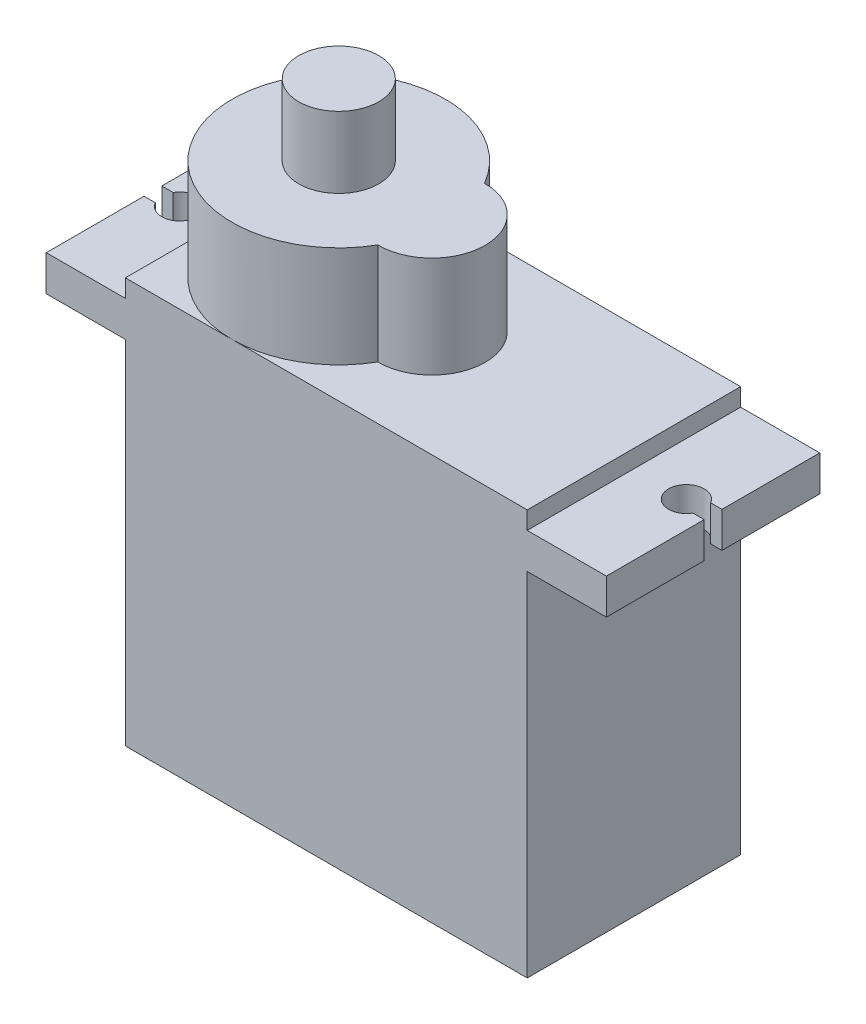
ISO-10303-21;
HEADER;
FILE_DESCRIPTION(('STEP AP214'),'2;1');
FILE_NAME('part.step','',(''),(''),'','','');
FILE_SCHEMA(('AUTOMOTIVE_DESIGN { 1 0 10303 214 1 1 1 1 }'));
ENDSEC;
DATA;
#1=APPLICATION_CONTEXT('core data for automotive mechanical design processes');
#2=APPLICATION_PROTOCOL_DEFINITION('international standard','automotive_design',2000,#1);
#3=PRODUCT_CONTEXT('',#1,'mechanical');
#4=PRODUCT('Part','Part','',(#3));
#5=PRODUCT_RELATED_PRODUCT_CATEGORY('part','',(#4));
#6=PRODUCT_DEFINITION_FORMATION('','',#4);
#7=PRODUCT_DEFINITION_CONTEXT('part definition',#1,'design');
#8=PRODUCT_DEFINITION('design','',#6,#7);
#9=PRODUCT_DEFINITION_SHAPE('','',#8);
#10=(LENGTH_UNIT() NAMED_UNIT(*) SI_UNIT(.MILLI.,.METRE.));
#11=(NAMED_UNIT(*) PLANE_ANGLE_UNIT() SI_UNIT($,.RADIAN.));
#12=(NAMED_UNIT(*) SI_UNIT($,.STERADIAN.) SOLID_ANGLE_UNIT());
#13=UNCERTAINTY_MEASURE_WITH_UNIT(LENGTH_MEASURE(1.E-05),#10,'distance_accuracy_value','');
#14=(GEOMETRIC_REPRESENTATION_CONTEXT(3) GLOBAL_UNCERTAINTY_ASSIGNED_CONTEXT((#13)) GLOBAL_UNIT_ASSIGNED_CONTEXT((#10,
#11,#12)) REPRESENTATION_CONTEXT('',''));
#15=CARTESIAN_POINT('',(0.,0.,0.));
#16=DIRECTION('',(0.,0.,1.));
#17=DIRECTION('',(1.,0.,0.));
#18=AXIS2_PLACEMENT_3D('',#15,#16,#17);
#19=CARTESIAN_POINT('',(0.,21.8,0.));
#20=DIRECTION('',(0.,1.,0.));
#21=DIRECTION('',(0.,0.,1.));
#22=AXIS2_PLACEMENT_3D('',#19,#20,#21);
#23=PLANE('',#22);
#24=CARTESIAN_POINT('',(-2.95,21.8,-6.));
#25=DIRECTION('',(0.,1.,0.));
#26=DIRECTION('',(0.,0.,1.));
#27=AXIS2_PLACEMENT_3D('',#24,#25,#26);
#28=CIRCLE('',#27,1.);
#29=CARTESIAN_POINT('',(-3.81602540378444,21.8,-5.5));
#30=VERTEX_POINT('',#29);
#31=CARTESIAN_POINT('',(-3.81602540378444,21.8,-6.5));
#32=VERTEX_POINT('',#31);
#33=EDGE_CURVE('E225',#30,#32,#28,.T.);
#34=ORIENTED_EDGE('',*,*,#33,.F.);
#35=DIRECTION('',(-1.,0.,0.));
#36=VECTOR('',#35,1.);
#37=CARTESIAN_POINT('',(0.,21.8,-5.5));
#38=LINE('',#37,#36);
#39=CARTESIAN_POINT('',(-4.45,21.8,-5.5));
#40=VERTEX_POINT('',#39);
#41=EDGE_CURVE('E204',#30,#40,#38,.T.);
#42=ORIENTED_EDGE('',*,*,#41,.T.);
#43=DIRECTION('',(0.,0.,1.));
#44=VECTOR('',#43,1.);
#45=CARTESIAN_POINT('',(-4.45,21.8,-12.));
#46=LINE('',#45,#44);
#47=CARTESIAN_POINT('',(-4.45,21.8,0.));
#48=VERTEX_POINT('',#47);
#49=EDGE_CURVE('E313',#40,#48,#46,.T.);
#50=ORIENTED_EDGE('',*,*,#49,.T.);
#51=DIRECTION('',(1.,0.,0.));
#52=VECTOR('',#51,1.);
#53=CARTESIAN_POINT('',(-4.45,21.8,0.));
#54=LINE('',#53,#52);
#55=CARTESIAN_POINT('',(0.,21.8,0.));
#56=VERTEX_POINT('',#55);
#57=EDGE_CURVE('E319',#48,#56,#54,.T.);
#58=ORIENTED_EDGE('',*,*,#57,.T.);
#59=DIRECTION('',(0.,0.,1.));
#60=VECTOR('',#59,1.);
#61=CARTESIAN_POINT('',(0.,21.8,0.));
#62=LINE('',#61,#60);
#63=CARTESIAN_POINT('',(0.,21.8,-12.));
#64=VERTEX_POINT('',#63);
#65=EDGE_CURVE('E278',#64,#56,#62,.T.);
#66=ORIENTED_EDGE('',*,*,#65,.F.);
#67=DIRECTION('',(-1.,0.,0.));
#68=VECTOR('',#67,1.);
#69=CARTESIAN_POINT('',(27.05,21.8,-12.));
#70=LINE('',#69,#68);
#71=CARTESIAN_POINT('',(-4.45,21.8,-12.));
#72=VERTEX_POINT('',#71);
#73=EDGE_CURVE('E314',#64,#72,#70,.T.);
#74=ORIENTED_EDGE('',*,*,#73,.T.);
#75=CARTESIAN_POINT('',(-4.45,21.8,-6.5));
#76=VERTEX_POINT('',#75);
#77=EDGE_CURVE('E315',#72,#76,#46,.T.);
#78=ORIENTED_EDGE('',*,*,#77,.T.);
#79=DIRECTION('',(1.,0.,0.));
#80=VECTOR('',#79,1.);
#81=CARTESIAN_POINT('',(0.,21.8,-6.5));
#82=LINE('',#81,#80);
#83=EDGE_CURVE('E55',#76,#32,#82,.T.);
#84=ORIENTED_EDGE('',*,*,#83,.T.);
#85=EDGE_LOOP('',(#34,#42,#50,#58,#66,#74,#78,#84));
#86=FACE_BOUND('',#85,.T.);
#87=ADVANCED_FACE('F38',(#86),#23,.T.);
#88=CARTESIAN_POINT('',(0.,19.8,0.));
#89=DIRECTION('',(0.,1.,0.));
#90=DIRECTION('',(0.,0.,1.));
#91=AXIS2_PLACEMENT_3D('',#88,#89,#90);
#92=PLANE('',#91);
#93=DIRECTION('',(1.,0.,0.));
#94=VECTOR('',#93,1.);
#95=CARTESIAN_POINT('',(0.,19.8,-5.5));
#96=LINE('',#95,#94);
#97=CARTESIAN_POINT('',(-4.45,19.8,-5.5));
#98=VERTEX_POINT('',#97);
#99=CARTESIAN_POINT('',(-3.81602540378444,19.8,-5.5));
#100=VERTEX_POINT('',#99);
#101=EDGE_CURVE('E201',#98,#100,#96,.T.);
#102=ORIENTED_EDGE('',*,*,#101,.T.);
#103=CARTESIAN_POINT('',(-2.95,19.8,-6.));
#104=DIRECTION('',(0.,1.,0.));
#105=DIRECTION('',(0.,0.,1.));
#106=AXIS2_PLACEMENT_3D('',#103,#104,#105);
#107=CIRCLE('',#106,1.);
#108=CARTESIAN_POINT('',(-3.81602540378444,19.8,-6.5));
#109=VERTEX_POINT('',#108);
#110=EDGE_CURVE('E211',#109,#100,#107,.F.);
#111=ORIENTED_EDGE('',*,*,#110,.F.);
#112=DIRECTION('',(-1.,0.,0.));
#113=VECTOR('',#112,1.);
#114=CARTESIAN_POINT('',(0.,19.8,-6.5));
#115=LINE('',#114,#113);
#116=CARTESIAN_POINT('',(-4.45,19.8,-6.5));
#117=VERTEX_POINT('',#116);
#118=EDGE_CURVE('E223',#109,#117,#115,.T.);
#119=ORIENTED_EDGE('',*,*,#118,.T.);
#120=DIRECTION('',(0.,0.,1.));
#121=VECTOR('',#120,1.);
#122=CARTESIAN_POINT('',(-4.45,19.8,-12.));
#123=LINE('',#122,#121);
#124=CARTESIAN_POINT('',(-4.45,19.8,-12.));
#125=VERTEX_POINT('',#124);
#126=EDGE_CURVE('E329',#125,#117,#123,.T.);
#127=ORIENTED_EDGE('',*,*,#126,.F.);
#128=DIRECTION('',(-1.,0.,0.));
#129=VECTOR('',#128,1.);
#130=CARTESIAN_POINT('',(27.05,19.8,-12.));
#131=LINE('',#130,#129);
#132=CARTESIAN_POINT('',(0.,19.8,-12.));
#133=VERTEX_POINT('',#132);
#134=EDGE_CURVE('E310',#133,#125,#131,.T.);
#135=ORIENTED_EDGE('',*,*,#134,.F.);
#136=DIRECTION('',(0.,0.,1.));
#137=VECTOR('',#136,1.);
#138=CARTESIAN_POINT('',(0.,19.8,0.));
#139=LINE('',#138,#137);
#140=CARTESIAN_POINT('',(0.,19.8,0.));
#141=VERTEX_POINT('',#140);
#142=EDGE_CURVE('E352',#133,#141,#139,.T.);
#143=ORIENTED_EDGE('',*,*,#142,.T.);
#144=DIRECTION('',(1.,0.,0.));
#145=VECTOR('',#144,1.);
#146=CARTESIAN_POINT('',(-4.45,19.8,0.));
#147=LINE('',#146,#145);
#148=CARTESIAN_POINT('',(-4.45,19.8,0.));
#149=VERTEX_POINT('',#148);
#150=EDGE_CURVE('E333',#149,#141,#147,.T.);
#151=ORIENTED_EDGE('',*,*,#150,.F.);
#152=EDGE_CURVE('E222',#98,#149,#123,.T.);
#153=ORIENTED_EDGE('',*,*,#152,.F.);
#154=EDGE_LOOP('',(#102,#111,#119,#127,#135,#143,#151,#153));
#155=FACE_BOUND('',#154,.T.);
#156=ADVANCED_FACE('F220',(#155),#92,.F.);
#157=CARTESIAN_POINT('',(-4.45,21.8,-12.));
#158=DIRECTION('',(1.,0.,0.));
#159=DIRECTION('',(0.,0.,-1.));
#160=AXIS2_PLACEMENT_3D('',#157,#158,#159);
#161=PLANE('',#160);
#162=DIRECTION('',(0.,1.,0.));
#163=VECTOR('',#162,1.);
#164=CARTESIAN_POINT('',(-4.45,-0.001000000000001,-5.5));
#165=LINE('',#164,#163);
#166=EDGE_CURVE('E217',#98,#40,#165,.T.);
#167=ORIENTED_EDGE('',*,*,#166,.F.);
#168=ORIENTED_EDGE('',*,*,#152,.T.);
#169=DIRECTION('',(0.,-1.,0.));
#170=VECTOR('',#169,1.);
#171=CARTESIAN_POINT('',(-4.45,21.8,0.));
#172=LINE('',#171,#170);
#173=EDGE_CURVE('E345',#48,#149,#172,.T.);
#174=ORIENTED_EDGE('',*,*,#173,.F.);
#175=ORIENTED_EDGE('',*,*,#49,.F.);
#176=EDGE_LOOP('',(#167,#168,#174,#175));
#177=FACE_BOUND('',#176,.T.);
#178=ADVANCED_FACE('F468',(#177),#161,.F.);
#179=DIRECTION('',(0.,1.,0.));
#180=VECTOR('',#179,1.);
#181=CARTESIAN_POINT('',(-4.45,-0.001000000000001,-6.5));
#182=LINE('',#181,#180);
#183=EDGE_CURVE('E233',#117,#76,#182,.T.);
#184=ORIENTED_EDGE('',*,*,#183,.T.);
#185=ORIENTED_EDGE('',*,*,#77,.F.);
#186=DIRECTION('',(0.,-1.,0.));
#187=VECTOR('',#186,1.);
#188=CARTESIAN_POINT('',(-4.45,21.8,-12.));
#189=LINE('',#188,#187);
#190=EDGE_CURVE('E348',#72,#125,#189,.T.);
#191=ORIENTED_EDGE('',*,*,#190,.T.);
#192=ORIENTED_EDGE('',*,*,#126,.T.);
#193=EDGE_LOOP('',(#184,#185,#191,#192));
#194=FACE_BOUND('',#193,.T.);
#195=ADVANCED_FACE('F430',(#194),#161,.F.);
#196=CARTESIAN_POINT('',(27.05,21.8,0.));
#197=DIRECTION('',(-1.,0.,0.));
#198=DIRECTION('',(0.,0.,1.));
#199=AXIS2_PLACEMENT_3D('',#196,#197,#198);
#200=PLANE('',#199);
#201=DIRECTION('',(0.,0.,-1.));
#202=VECTOR('',#201,1.);
#203=CARTESIAN_POINT('',(27.05,21.8,0.));
#204=LINE('',#203,#202);
#205=CARTESIAN_POINT('',(27.05,21.8,-6.5));
#206=VERTEX_POINT('',#205);
#207=CARTESIAN_POINT('',(27.05,21.8,-12.));
#208=VERTEX_POINT('',#207);
#209=EDGE_CURVE('E321',#206,#208,#204,.T.);
#210=ORIENTED_EDGE('',*,*,#209,.F.);
#211=DIRECTION('',(0.,1.,0.));
#212=VECTOR('',#211,1.);
#213=CARTESIAN_POINT('',(27.05,-0.001000000000001,-6.5));
#214=LINE('',#213,#212);
#215=CARTESIAN_POINT('',(27.05,19.8,-6.5));
#216=VERTEX_POINT('',#215);
#217=EDGE_CURVE('E250',#216,#206,#214,.T.);
#218=ORIENTED_EDGE('',*,*,#217,.F.);
#219=DIRECTION('',(0.,0.,-1.));
#220=VECTOR('',#219,1.);
#221=CARTESIAN_POINT('',(27.05,19.8,0.));
#222=LINE('',#221,#220);
#223=CARTESIAN_POINT('',(27.05,19.8,-12.));
#224=VERTEX_POINT('',#223);
#225=EDGE_CURVE('E336',#216,#224,#222,.T.);
#226=ORIENTED_EDGE('',*,*,#225,.T.);
#227=DIRECTION('',(0.,-1.,0.));
#228=VECTOR('',#227,1.);
#229=CARTESIAN_POINT('',(27.05,21.8,-12.));
#230=LINE('',#229,#228);
#231=EDGE_CURVE('E325',#208,#224,#230,.T.);
#232=ORIENTED_EDGE('',*,*,#231,.F.);
#233=EDGE_LOOP('',(#210,#218,#226,#232));
#234=FACE_BOUND('',#233,.T.);
#235=ADVANCED_FACE('F412',(#234),#200,.F.);
#236=CARTESIAN_POINT('',(0.,22.8,0.));
#237=DIRECTION('',(0.,-1.,0.));
#238=DIRECTION('',(0.,0.,-1.));
#239=AXIS2_PLACEMENT_3D('',#236,#237,#238);
#240=PLANE('',#239);
#241=CARTESIAN_POINT('',(6.,22.8,-6.));
#242=DIRECTION('',(0.,1.,0.));
#243=DIRECTION('',(0.,0.,1.));
#244=AXIS2_PLACEMENT_3D('',#241,#242,#243);
#245=CIRCLE('',#244,6.);
#246=CARTESIAN_POINT('',(11.1963070609208,22.8,-8.99973214281289));
#247=VERTEX_POINT('',#246);
#248=CARTESIAN_POINT('',(6.,22.8,-12.));
#249=VERTEX_POINT('',#248);
#250=EDGE_CURVE('E259',#247,#249,#245,.T.);
#251=ORIENTED_EDGE('',*,*,#250,.F.);
#252=CARTESIAN_POINT('',(11.236395355661,22.8,-6.));
#253=DIRECTION('',(0.,1.,0.));
#254=DIRECTION('',(0.,0.,1.));
#255=AXIS2_PLACEMENT_3D('',#252,#253,#254);
#256=CIRCLE('',#255,3.);
#257=CARTESIAN_POINT('',(11.1963070609208,22.8,-3.00026785718711));
#258=VERTEX_POINT('',#257);
#259=EDGE_CURVE('E265',#258,#247,#256,.T.);
#260=ORIENTED_EDGE('',*,*,#259,.F.);
#261=CARTESIAN_POINT('',(6.,22.8,0.));
#262=VERTEX_POINT('',#261);
#263=EDGE_CURVE('E270',#262,#258,#245,.T.);
#264=ORIENTED_EDGE('',*,*,#263,.F.);
#265=DIRECTION('',(1.,0.,0.));
#266=VECTOR('',#265,1.);
#267=CARTESIAN_POINT('',(0.,22.8,0.));
#268=LINE('',#267,#266);
#269=CARTESIAN_POINT('',(22.6,22.8,0.));
#270=VERTEX_POINT('',#269);
#271=EDGE_CURVE('E282',#262,#270,#268,.T.);
#272=ORIENTED_EDGE('',*,*,#271,.T.);
#273=DIRECTION('',(0.,0.,-1.));
#274=VECTOR('',#273,1.);
#275=CARTESIAN_POINT('',(22.6,22.8,0.));
#276=LINE('',#275,#274);
#277=CARTESIAN_POINT('',(22.6,22.8,-12.));
#278=VERTEX_POINT('',#277);
#279=EDGE_CURVE('E287',#270,#278,#276,.T.);
#280=ORIENTED_EDGE('',*,*,#279,.T.);
#281=DIRECTION('',(-1.,0.,0.));
#282=VECTOR('',#281,1.);
#283=CARTESIAN_POINT('',(0.,22.8,-12.));
#284=LINE('',#283,#282);
#285=EDGE_CURVE('E290',#278,#249,#284,.T.);
#286=ORIENTED_EDGE('',*,*,#285,.T.);
#287=EDGE_LOOP('',(#251,#260,#264,#272,#280,#286));
#288=FACE_BOUND('',#287,.T.);
#289=ADVANCED_FACE('F395',(#288),#240,.F.);
#290=CARTESIAN_POINT('',(0.,22.8,-6.));
#291=VERTEX_POINT('',#290);
#292=EDGE_CURVE('E47',#249,#291,#245,.T.);
#293=ORIENTED_EDGE('',*,*,#292,.F.);
#294=CARTESIAN_POINT('',(0.,22.8,-12.));
#295=VERTEX_POINT('',#294);
#296=EDGE_CURVE('E289',#249,#295,#284,.T.);
#297=ORIENTED_EDGE('',*,*,#296,.T.);
#298=DIRECTION('',(0.,0.,1.));
#299=VECTOR('',#298,1.);
#300=CARTESIAN_POINT('',(0.,22.8,0.));
#301=LINE('',#300,#299);
#302=EDGE_CURVE('E279',#295,#291,#301,.T.);
#303=ORIENTED_EDGE('',*,*,#302,.T.);
#304=EDGE_LOOP('',(#293,#297,#303));
#305=FACE_BOUND('',#304,.T.);
#306=ADVANCED_FACE('F387',(#305),#240,.F.);
#307=CARTESIAN_POINT('',(0.,19.8,0.));
#308=DIRECTION('',(1.,0.,0.));
#309=DIRECTION('',(0.,0.,-1.));
#310=AXIS2_PLACEMENT_3D('',#307,#308,#309);
#311=PLANE('',#310);
#312=DIRECTION('',(0.,0.,1.));
#313=VECTOR('',#312,1.);
#314=CARTESIAN_POINT('',(0.,0.,0.));
#315=LINE('',#314,#313);
#316=CARTESIAN_POINT('',(0.,0.,-12.));
#317=VERTEX_POINT('',#316);
#318=CARTESIAN_POINT('',(0.,0.,0.));
#319=VERTEX_POINT('',#318);
#320=EDGE_CURVE('E351',#317,#319,#315,.T.);
#321=ORIENTED_EDGE('',*,*,#320,.T.);
#322=DIRECTION('',(0.,-1.,0.));
#323=VECTOR('',#322,1.);
#324=CARTESIAN_POINT('',(0.,19.8,0.));
#325=LINE('',#324,#323);
#326=EDGE_CURVE('E42',#141,#319,#325,.T.);
#327=ORIENTED_EDGE('',*,*,#326,.F.);
#328=ORIENTED_EDGE('',*,*,#142,.F.);
#329=DIRECTION('',(0.,-1.,0.));
#330=VECTOR('',#329,1.);
#331=CARTESIAN_POINT('',(0.,19.8,-12.));
#332=LINE('',#331,#330);
#333=EDGE_CURVE('E359',#133,#317,#332,.T.);
#334=ORIENTED_EDGE('',*,*,#333,.T.);
#335=EDGE_LOOP('',(#321,#327,#328,#334));
#336=FACE_BOUND('',#335,.T.);
#337=ADVANCED_FACE('F40',(#336),#311,.F.);
#338=CARTESIAN_POINT('',(0.,19.8,0.));
#339=DIRECTION('',(0.,0.,-1.));
#340=DIRECTION('',(-1.,0.,0.));
#341=AXIS2_PLACEMENT_3D('',#338,#339,#340);
#342=PLANE('',#341);
#343=DIRECTION('',(1.,0.,0.));
#344=VECTOR('',#343,1.);
#345=CARTESIAN_POINT('',(0.,0.,0.));
#346=LINE('',#345,#344);
#347=CARTESIAN_POINT('',(22.6,0.,0.));
#348=VERTEX_POINT('',#347);
#349=EDGE_CURVE('E362',#319,#348,#346,.T.);
#350=ORIENTED_EDGE('',*,*,#349,.T.);
#351=DIRECTION('',(0.,-1.,0.));
#352=VECTOR('',#351,1.);
#353=CARTESIAN_POINT('',(22.6,19.8,0.));
#354=LINE('',#353,#352);
#355=CARTESIAN_POINT('',(22.6,19.8,0.));
#356=VERTEX_POINT('',#355);
#357=EDGE_CURVE('E371',#356,#348,#354,.T.);
#358=ORIENTED_EDGE('',*,*,#357,.F.);
#359=CARTESIAN_POINT('',(27.05,19.8,0.));
#360=VERTEX_POINT('',#359);
#361=EDGE_CURVE('E332',#356,#360,#147,.T.);
#362=ORIENTED_EDGE('',*,*,#361,.T.);
#363=DIRECTION('',(0.,-1.,0.));
#364=VECTOR('',#363,1.);
#365=CARTESIAN_POINT('',(27.05,21.8,0.));
#366=LINE('',#365,#364);
#367=CARTESIAN_POINT('',(27.05,21.8,0.));
#368=VERTEX_POINT('',#367);
#369=EDGE_CURVE('E342',#368,#360,#366,.T.);
#370=ORIENTED_EDGE('',*,*,#369,.F.);
#371=CARTESIAN_POINT('',(22.6,21.8,0.));
#372=VERTEX_POINT('',#371);
#373=EDGE_CURVE('E318',#372,#368,#54,.T.);
#374=ORIENTED_EDGE('',*,*,#373,.F.);
#375=DIRECTION('',(0.,-1.,0.));
#376=VECTOR('',#375,1.);
#377=CARTESIAN_POINT('',(22.6,22.8,0.));
#378=LINE('',#377,#376);
#379=EDGE_CURVE('E304',#270,#372,#378,.T.);
#380=ORIENTED_EDGE('',*,*,#379,.F.);
#381=ORIENTED_EDGE('',*,*,#271,.F.);
#382=CARTESIAN_POINT('',(0.,22.8,0.));
#383=VERTEX_POINT('',#382);
#384=EDGE_CURVE('E284',#383,#262,#268,.T.);
#385=ORIENTED_EDGE('',*,*,#384,.F.);
#386=DIRECTION('',(0.,-1.,0.));
#387=VECTOR('',#386,1.);
#388=CARTESIAN_POINT('',(0.,22.8,0.));
#389=LINE('',#388,#387);
#390=EDGE_CURVE('E307',#383,#56,#389,.T.);
#391=ORIENTED_EDGE('',*,*,#390,.T.);
#392=ORIENTED_EDGE('',*,*,#57,.F.);
#393=ORIENTED_EDGE('',*,*,#173,.T.);
#394=ORIENTED_EDGE('',*,*,#150,.T.);
#395=ORIENTED_EDGE('',*,*,#326,.T.);
#396=EDGE_LOOP('',(#350,#358,#362,#370,#374,#380,#381,#385,#391,#392,#393,#394,#395));
#397=FACE_BOUND('',#396,.T.);
#398=ADVANCED_FACE('F439',(#397),#342,.F.);
#399=CARTESIAN_POINT('',(22.6,19.8,0.));
#400=DIRECTION('',(-1.,0.,0.));
#401=DIRECTION('',(0.,0.,1.));
#402=AXIS2_PLACEMENT_3D('',#399,#400,#401);
#403=PLANE('',#402);
#404=DIRECTION('',(0.,0.,-1.));
#405=VECTOR('',#404,1.);
#406=CARTESIAN_POINT('',(22.6,0.,0.));
#407=LINE('',#406,#405);
#408=CARTESIAN_POINT('',(22.6,0.,-12.));
#409=VERTEX_POINT('',#408);
#410=EDGE_CURVE('E364',#348,#409,#407,.T.);
#411=ORIENTED_EDGE('',*,*,#410,.T.);
#412=DIRECTION('',(0.,-1.,0.));
#413=VECTOR('',#412,1.);
#414=CARTESIAN_POINT('',(22.6,19.8,-12.));
#415=LINE('',#414,#413);
#416=CARTESIAN_POINT('',(22.6,19.8,-12.));
#417=VERTEX_POINT('',#416);
#418=EDGE_CURVE('E369',#417,#409,#415,.T.);
#419=ORIENTED_EDGE('',*,*,#418,.F.);
#420=DIRECTION('',(0.,0.,-1.));
#421=VECTOR('',#420,1.);
#422=CARTESIAN_POINT('',(22.6,19.8,0.));
#423=LINE('',#422,#421);
#424=EDGE_CURVE('E355',#356,#417,#423,.T.);
#425=ORIENTED_EDGE('',*,*,#424,.F.);
#426=ORIENTED_EDGE('',*,*,#357,.T.);
#427=EDGE_LOOP('',(#411,#419,#425,#426));
#428=FACE_BOUND('',#427,.T.);
#429=ADVANCED_FACE('F496',(#428),#403,.F.);
#430=CARTESIAN_POINT('',(0.,19.8,-12.));
#431=DIRECTION('',(0.,0.,1.));
#432=DIRECTION('',(1.,0.,0.));
#433=AXIS2_PLACEMENT_3D('',#430,#431,#432);
#434=PLANE('',#433);
#435=DIRECTION('',(-1.,0.,0.));
#436=VECTOR('',#435,1.);
#437=CARTESIAN_POINT('',(0.,0.,-12.));
#438=LINE('',#437,#436);
#439=EDGE_CURVE('E356',#409,#317,#438,.T.);
#440=ORIENTED_EDGE('',*,*,#439,.T.);
#441=ORIENTED_EDGE('',*,*,#333,.F.);
#442=ORIENTED_EDGE('',*,*,#134,.T.);
#443=ORIENTED_EDGE('',*,*,#190,.F.);
#444=ORIENTED_EDGE('',*,*,#73,.F.);
#445=DIRECTION('',(0.,-1.,0.));
#446=VECTOR('',#445,1.);
#447=CARTESIAN_POINT('',(0.,22.8,-12.));
#448=LINE('',#447,#446);
#449=EDGE_CURVE('E293',#295,#64,#448,.T.);
#450=ORIENTED_EDGE('',*,*,#449,.F.);
#451=ORIENTED_EDGE('',*,*,#296,.F.);
#452=ORIENTED_EDGE('',*,*,#285,.F.);
#453=DIRECTION('',(0.,-1.,0.));
#454=VECTOR('',#453,1.);
#455=CARTESIAN_POINT('',(22.6,22.8,-12.));
#456=LINE('',#455,#454);
#457=CARTESIAN_POINT('',(22.6,21.8,-12.));
#458=VERTEX_POINT('',#457);
#459=EDGE_CURVE('E301',#278,#458,#456,.T.);
#460=ORIENTED_EDGE('',*,*,#459,.T.);
#461=EDGE_CURVE('E311',#208,#458,#70,.T.);
#462=ORIENTED_EDGE('',*,*,#461,.F.);
#463=ORIENTED_EDGE('',*,*,#231,.T.);
#464=EDGE_CURVE('E326',#224,#417,#131,.T.);
#465=ORIENTED_EDGE('',*,*,#464,.T.);
#466=ORIENTED_EDGE('',*,*,#418,.T.);
#467=EDGE_LOOP('',(#440,#441,#442,#443,#444,#450,#451,#452,#460,#462,#463,#465,#466));
#468=FACE_BOUND('',#467,.T.);
#469=ADVANCED_FACE('F392',(#468),#434,.F.);
#470=CARTESIAN_POINT('',(0.,0.,0.));
#471=DIRECTION('',(0.,-1.,0.));
#472=DIRECTION('',(0.,0.,-1.));
#473=AXIS2_PLACEMENT_3D('',#470,#471,#472);
#474=PLANE('',#473);
#475=ORIENTED_EDGE('',*,*,#320,.F.);
#476=ORIENTED_EDGE('',*,*,#439,.F.);
#477=ORIENTED_EDGE('',*,*,#410,.F.);
#478=ORIENTED_EDGE('',*,*,#349,.F.);
#479=EDGE_LOOP('',(#475,#476,#477,#478));
#480=FACE_BOUND('',#479,.T.);
#481=ADVANCED_FACE('F422',(#480),#474,.T.);
#482=ORIENTED_EDGE('',*,*,#225,.F.);
#483=DIRECTION('',(1.,0.,0.));
#484=VECTOR('',#483,1.);
#485=CARTESIAN_POINT('',(0.,19.8,-6.49999999999999));
#486=LINE('',#485,#484);
#487=CARTESIAN_POINT('',(26.4160254037844,19.8,-6.5));
#488=VERTEX_POINT('',#487);
#489=EDGE_CURVE('E239',#488,#216,#486,.T.);
#490=ORIENTED_EDGE('',*,*,#489,.F.);
#491=CARTESIAN_POINT('',(25.55,19.8,-6.));
#492=DIRECTION('',(0.,1.,0.));
#493=DIRECTION('',(0.,0.,1.));
#494=AXIS2_PLACEMENT_3D('',#491,#492,#493);
#495=CIRCLE('',#494,1.);
#496=CARTESIAN_POINT('',(26.4160254037844,19.8,-5.5));
#497=VERTEX_POINT('',#496);
#498=EDGE_CURVE('E236',#497,#488,#495,.F.);
#499=ORIENTED_EDGE('',*,*,#498,.F.);
#500=DIRECTION('',(-1.,0.,0.));
#501=VECTOR('',#500,1.);
#502=CARTESIAN_POINT('',(0.,19.8,-5.5));
#503=LINE('',#502,#501);
#504=CARTESIAN_POINT('',(27.05,19.8,-5.5));
#505=VERTEX_POINT('',#504);
#506=EDGE_CURVE('E227',#505,#497,#503,.T.);
#507=ORIENTED_EDGE('',*,*,#506,.F.);
#508=EDGE_CURVE('E337',#360,#505,#222,.T.);
#509=ORIENTED_EDGE('',*,*,#508,.F.);
#510=ORIENTED_EDGE('',*,*,#361,.F.);
#511=ORIENTED_EDGE('',*,*,#424,.T.);
#512=ORIENTED_EDGE('',*,*,#464,.F.);
#513=EDGE_LOOP('',(#482,#490,#499,#507,#509,#510,#511,#512));
#514=FACE_BOUND('',#513,.T.);
#515=ADVANCED_FACE('F416',(#514),#92,.F.);
#516=ORIENTED_EDGE('',*,*,#508,.T.);
#517=DIRECTION('',(0.,1.,0.));
#518=VECTOR('',#517,1.);
#519=CARTESIAN_POINT('',(27.05,-0.001000000000001,-5.5));
#520=LINE('',#519,#518);
#521=CARTESIAN_POINT('',(27.05,21.8,-5.5));
#522=VERTEX_POINT('',#521);
#523=EDGE_CURVE('E252',#505,#522,#520,.T.);
#524=ORIENTED_EDGE('',*,*,#523,.T.);
#525=EDGE_CURVE('E322',#368,#522,#204,.T.);
#526=ORIENTED_EDGE('',*,*,#525,.F.);
#527=ORIENTED_EDGE('',*,*,#369,.T.);
#528=EDGE_LOOP('',(#516,#524,#526,#527));
#529=FACE_BOUND('',#528,.T.);
#530=ADVANCED_FACE('F445',(#529),#200,.F.);
#531=DIRECTION('',(-1.,0.,0.));
#532=VECTOR('',#531,1.);
#533=CARTESIAN_POINT('',(0.,21.8,-6.49999999999999));
#534=LINE('',#533,#532);
#535=CARTESIAN_POINT('',(26.4160254037844,21.8,-6.5));
#536=VERTEX_POINT('',#535);
#537=EDGE_CURVE('E244',#206,#536,#534,.T.);
#538=ORIENTED_EDGE('',*,*,#537,.F.);
#539=ORIENTED_EDGE('',*,*,#209,.T.);
#540=ORIENTED_EDGE('',*,*,#461,.T.);
#541=DIRECTION('',(0.,0.,-1.));
#542=VECTOR('',#541,1.);
#543=CARTESIAN_POINT('',(22.6,21.8,0.));
#544=LINE('',#543,#542);
#545=EDGE_CURVE('E296',#372,#458,#544,.T.);
#546=ORIENTED_EDGE('',*,*,#545,.F.);
#547=ORIENTED_EDGE('',*,*,#373,.T.);
#548=ORIENTED_EDGE('',*,*,#525,.T.);
#549=DIRECTION('',(1.,0.,0.));
#550=VECTOR('',#549,1.);
#551=CARTESIAN_POINT('',(0.,21.8,-5.5));
#552=LINE('',#551,#550);
#553=CARTESIAN_POINT('',(26.4160254037844,21.8,-5.5));
#554=VERTEX_POINT('',#553);
#555=EDGE_CURVE('E242',#554,#522,#552,.T.);
#556=ORIENTED_EDGE('',*,*,#555,.F.);
#557=CARTESIAN_POINT('',(25.55,21.8,-6.));
#558=DIRECTION('',(0.,1.,0.));
#559=DIRECTION('',(0.,0.,1.));
#560=AXIS2_PLACEMENT_3D('',#557,#558,#559);
#561=CIRCLE('',#560,1.);
#562=EDGE_CURVE('E63',#536,#554,#561,.T.);
#563=ORIENTED_EDGE('',*,*,#562,.F.);
#564=EDGE_LOOP('',(#538,#539,#540,#546,#547,#548,#556,#563));
#565=FACE_BOUND('',#564,.T.);
#566=ADVANCED_FACE('F407',(#565),#23,.T.);
#567=CARTESIAN_POINT('',(0.,22.8,0.));
#568=DIRECTION('',(1.,0.,0.));
#569=DIRECTION('',(0.,0.,-1.));
#570=AXIS2_PLACEMENT_3D('',#567,#568,#569);
#571=PLANE('',#570);
#572=ORIENTED_EDGE('',*,*,#65,.T.);
#573=ORIENTED_EDGE('',*,*,#390,.F.);
#574=EDGE_CURVE('E283',#291,#383,#301,.T.);
#575=ORIENTED_EDGE('',*,*,#574,.F.);
#576=ORIENTED_EDGE('',*,*,#302,.F.);
#577=ORIENTED_EDGE('',*,*,#449,.T.);
#578=EDGE_LOOP('',(#572,#573,#575,#576,#577));
#579=FACE_BOUND('',#578,.T.);
#580=ADVANCED_FACE('F433',(#579),#571,.F.);
#581=CARTESIAN_POINT('',(22.6,22.8,0.));
#582=DIRECTION('',(-1.,0.,0.));
#583=DIRECTION('',(0.,0.,1.));
#584=AXIS2_PLACEMENT_3D('',#581,#582,#583);
#585=PLANE('',#584);
#586=ORIENTED_EDGE('',*,*,#545,.T.);
#587=ORIENTED_EDGE('',*,*,#459,.F.);
#588=ORIENTED_EDGE('',*,*,#279,.F.);
#589=ORIENTED_EDGE('',*,*,#379,.T.);
#590=EDGE_LOOP('',(#586,#587,#588,#589));
#591=FACE_BOUND('',#590,.T.);
#592=ADVANCED_FACE('F401',(#591),#585,.F.);
#593=EDGE_CURVE('E379',#291,#262,#245,.T.);
#594=ORIENTED_EDGE('',*,*,#593,.F.);
#595=ORIENTED_EDGE('',*,*,#574,.T.);
#596=ORIENTED_EDGE('',*,*,#384,.T.);
#597=EDGE_LOOP('',(#594,#595,#596));
#598=FACE_BOUND('',#597,.T.);
#599=ADVANCED_FACE('F438',(#598),#240,.F.);
#600=CARTESIAN_POINT('',(6.,28.5,-6.));
#601=DIRECTION('',(0.,-1.,0.));
#602=DIRECTION('',(0.,0.,-1.));
#603=AXIS2_PLACEMENT_3D('',#600,#601,#602);
#604=CYLINDRICAL_SURFACE('',#603,6.);
#605=ORIENTED_EDGE('',*,*,#250,.T.);
#606=ORIENTED_EDGE('',*,*,#292,.T.);
#607=ORIENTED_EDGE('',*,*,#593,.T.);
#608=ORIENTED_EDGE('',*,*,#263,.T.);
#609=DIRECTION('',(0.,-1.,0.));
#610=VECTOR('',#609,1.);
#611=CARTESIAN_POINT('',(11.1963070609208,28.5,-3.00026785718711));
#612=LINE('',#611,#610);
#613=CARTESIAN_POINT('',(11.1963070609208,28.5,-3.00026785718711));
#614=VERTEX_POINT('',#613);
#615=EDGE_CURVE('E275',#614,#258,#612,.T.);
#616=ORIENTED_EDGE('',*,*,#615,.F.);
#617=CARTESIAN_POINT('',(6.,28.5,-6.));
#618=DIRECTION('',(0.,1.,0.));
#619=DIRECTION('',(0.,0.,1.));
#620=AXIS2_PLACEMENT_3D('',#617,#618,#619);
#621=CIRCLE('',#620,6.);
#622=CARTESIAN_POINT('',(11.1963070609208,28.5,-8.99973214281289));
#623=VERTEX_POINT('',#622);
#624=EDGE_CURVE('E261',#623,#614,#621,.T.);
#625=ORIENTED_EDGE('',*,*,#624,.F.);
#626=DIRECTION('',(0.,-1.,0.));
#627=VECTOR('',#626,1.);
#628=CARTESIAN_POINT('',(11.1963070609208,28.5,-8.99973214281289));
#629=LINE('',#628,#627);
#630=EDGE_CURVE('E267',#623,#247,#629,.T.);
#631=ORIENTED_EDGE('',*,*,#630,.T.);
#632=EDGE_LOOP('',(#605,#606,#607,#608,#616,#625,#631));
#633=FACE_BOUND('',#632,.T.);
#634=ADVANCED_FACE('F384',(#633),#604,.T.);
#635=CARTESIAN_POINT('',(11.236395355661,28.5,-6.));
#636=DIRECTION('',(0.,-1.,0.));
#637=DIRECTION('',(0.,0.,-1.));
#638=AXIS2_PLACEMENT_3D('',#635,#636,#637);
#639=CYLINDRICAL_SURFACE('',#638,3.);
#640=ORIENTED_EDGE('',*,*,#259,.T.);
#641=ORIENTED_EDGE('',*,*,#630,.F.);
#642=CARTESIAN_POINT('',(11.236395355661,28.5,-6.));
#643=DIRECTION('',(0.,1.,0.));
#644=DIRECTION('',(0.,0.,1.));
#645=AXIS2_PLACEMENT_3D('',#642,#643,#644);
#646=CIRCLE('',#645,3.);
#647=EDGE_CURVE('E264',#614,#623,#646,.T.);
#648=ORIENTED_EDGE('',*,*,#647,.F.);
#649=ORIENTED_EDGE('',*,*,#615,.T.);
#650=EDGE_LOOP('',(#640,#641,#648,#649));
#651=FACE_BOUND('',#650,.T.);
#652=ADVANCED_FACE('F514',(#651),#639,.T.);
#653=CARTESIAN_POINT('',(0.,28.5,0.));
#654=DIRECTION('',(0.,1.,0.));
#655=DIRECTION('',(0.,0.,1.));
#656=AXIS2_PLACEMENT_3D('',#653,#654,#655);
#657=PLANE('',#656);
#658=CARTESIAN_POINT('',(6.,28.5,-6.));
#659=DIRECTION('',(0.,1.,0.));
#660=DIRECTION('',(0.,0.,1.));
#661=AXIS2_PLACEMENT_3D('',#658,#659,#660);
#662=CIRCLE('',#661,2.25);
#663=CARTESIAN_POINT('',(6.,28.5,-3.75));
#664=VERTEX_POINT('',#663);
#665=EDGE_CURVE('E11',#664,#664,#662,.T.);
#666=ORIENTED_EDGE('',*,*,#665,.F.);
#667=EDGE_LOOP('',(#666));
#668=FACE_BOUND('',#667,.T.);
#669=ORIENTED_EDGE('',*,*,#624,.T.);
#670=ORIENTED_EDGE('',*,*,#647,.T.);
#671=EDGE_LOOP('',(#669,#670));
#672=FACE_BOUND('',#671,.T.);
#673=ADVANCED_FACE('F547',(#668,#672),#657,.T.);
#674=CARTESIAN_POINT('',(6.,32.5,-6.));
#675=DIRECTION('',(0.,-1.,0.));
#676=DIRECTION('',(0.,0.,-1.));
#677=AXIS2_PLACEMENT_3D('',#674,#675,#676);
#678=CYLINDRICAL_SURFACE('',#677,2.25);
#679=CARTESIAN_POINT('',(6.,32.5,-6.));
#680=DIRECTION('',(0.,1.,0.));
#681=DIRECTION('',(0.,0.,1.));
#682=AXIS2_PLACEMENT_3D('',#679,#680,#681);
#683=CIRCLE('',#682,2.25);
#684=CARTESIAN_POINT('',(6.,32.5,-3.75));
#685=VERTEX_POINT('',#684);
#686=EDGE_CURVE('E216',#685,#685,#683,.T.);
#687=ORIENTED_EDGE('',*,*,#686,.F.);
#688=EDGE_LOOP('',(#687));
#689=FACE_BOUND('',#688,.T.);
#690=ORIENTED_EDGE('',*,*,#665,.T.);
#691=EDGE_LOOP('',(#690));
#692=FACE_BOUND('',#691,.T.);
#693=ADVANCED_FACE('F558',(#689,#692),#678,.T.);
#694=CARTESIAN_POINT('',(6.,32.5,-6.));
#695=DIRECTION('',(0.,1.,0.));
#696=DIRECTION('',(0.,0.,1.));
#697=AXIS2_PLACEMENT_3D('',#694,#695,#696);
#698=PLANE('',#697);
#699=ORIENTED_EDGE('',*,*,#686,.T.);
#700=EDGE_LOOP('',(#699));
#701=FACE_BOUND('',#700,.T.);
#702=ADVANCED_FACE('F460',(#701),#698,.T.);
#703=CARTESIAN_POINT('',(25.55,-0.001000000000001,-6.));
#704=DIRECTION('',(0.,1.,0.));
#705=DIRECTION('',(0.,0.,1.));
#706=AXIS2_PLACEMENT_3D('',#703,#704,#705);
#707=CYLINDRICAL_SURFACE('',#706,1.);
#708=ORIENTED_EDGE('',*,*,#498,.T.);
#709=DIRECTION('',(0.,1.,0.));
#710=VECTOR('',#709,1.);
#711=CARTESIAN_POINT('',(26.4160254037844,-0.001000000000001,-6.5));
#712=LINE('',#711,#710);
#713=EDGE_CURVE('E248',#488,#536,#712,.T.);
#714=ORIENTED_EDGE('',*,*,#713,.T.);
#715=ORIENTED_EDGE('',*,*,#562,.T.);
#716=DIRECTION('',(0.,1.,0.));
#717=VECTOR('',#716,1.);
#718=CARTESIAN_POINT('',(26.4160254037844,-0.001000000000001,-5.5));
#719=LINE('',#718,#717);
#720=EDGE_CURVE('E247',#497,#554,#719,.T.);
#721=ORIENTED_EDGE('',*,*,#720,.F.);
#722=EDGE_LOOP('',(#708,#714,#715,#721));
#723=FACE_BOUND('',#722,.T.);
#724=ADVANCED_FACE('F450',(#723),#707,.F.);
#725=CARTESIAN_POINT('',(0.,-0.001000000000001,-6.49999999999999));
#726=DIRECTION('',(0.,0.,-1.));
#727=DIRECTION('',(-1.,0.,0.));
#728=AXIS2_PLACEMENT_3D('',#725,#726,#727);
#729=PLANE('',#728);
#730=ORIENTED_EDGE('',*,*,#489,.T.);
#731=ORIENTED_EDGE('',*,*,#217,.T.);
#732=ORIENTED_EDGE('',*,*,#537,.T.);
#733=ORIENTED_EDGE('',*,*,#713,.F.);
#734=EDGE_LOOP('',(#730,#731,#732,#733));
#735=FACE_BOUND('',#734,.T.);
#736=ADVANCED_FACE('F452',(#735),#729,.F.);
#737=CARTESIAN_POINT('',(0.,-0.001000000000001,-5.5));
#738=DIRECTION('',(0.,0.,1.));
#739=DIRECTION('',(1.,0.,0.));
#740=AXIS2_PLACEMENT_3D('',#737,#738,#739);
#741=PLANE('',#740);
#742=ORIENTED_EDGE('',*,*,#506,.T.);
#743=ORIENTED_EDGE('',*,*,#720,.T.);
#744=ORIENTED_EDGE('',*,*,#555,.T.);
#745=ORIENTED_EDGE('',*,*,#523,.F.);
#746=EDGE_LOOP('',(#742,#743,#744,#745));
#747=FACE_BOUND('',#746,.T.);
#748=ADVANCED_FACE('F449',(#747),#741,.F.);
#749=CARTESIAN_POINT('',(0.,-0.001000000000001,-5.5));
#750=DIRECTION('',(0.,0.,-1.));
#751=DIRECTION('',(-1.,0.,0.));
#752=AXIS2_PLACEMENT_3D('',#749,#750,#751);
#753=PLANE('',#752);
#754=ORIENTED_EDGE('',*,*,#166,.T.);
#755=ORIENTED_EDGE('',*,*,#41,.F.);
#756=DIRECTION('',(0.,1.,0.));
#757=VECTOR('',#756,1.);
#758=CARTESIAN_POINT('',(-3.81602540378444,-0.001000000000001,-5.5));
#759=LINE('',#758,#757);
#760=EDGE_CURVE('E197',#100,#30,#759,.T.);
#761=ORIENTED_EDGE('',*,*,#760,.F.);
#762=ORIENTED_EDGE('',*,*,#101,.F.);
#763=EDGE_LOOP('',(#754,#755,#761,#762));
#764=FACE_BOUND('',#763,.T.);
#765=ADVANCED_FACE('F199',(#764),#753,.T.);
#766=CARTESIAN_POINT('',(0.,-0.001000000000001,-6.5));
#767=DIRECTION('',(0.,0.,1.));
#768=DIRECTION('',(1.,0.,0.));
#769=AXIS2_PLACEMENT_3D('',#766,#767,#768);
#770=PLANE('',#769);
#771=DIRECTION('',(0.,1.,0.));
#772=VECTOR('',#771,1.);
#773=CARTESIAN_POINT('',(-3.81602540378444,-0.001000000000001,-6.5));
#774=LINE('',#773,#772);
#775=EDGE_CURVE('E208',#109,#32,#774,.T.);
#776=ORIENTED_EDGE('',*,*,#775,.T.);
#777=ORIENTED_EDGE('',*,*,#83,.F.);
#778=ORIENTED_EDGE('',*,*,#183,.F.);
#779=ORIENTED_EDGE('',*,*,#118,.F.);
#780=EDGE_LOOP('',(#776,#777,#778,#779));
#781=FACE_BOUND('',#780,.T.);
#782=ADVANCED_FACE('F642',(#781),#770,.T.);
#783=CARTESIAN_POINT('',(-2.95,-0.001000000000001,-6.));
#784=DIRECTION('',(0.,1.,0.));
#785=DIRECTION('',(0.,0.,1.));
#786=AXIS2_PLACEMENT_3D('',#783,#784,#785);
#787=CYLINDRICAL_SURFACE('',#786,1.);
#788=ORIENTED_EDGE('',*,*,#110,.T.);
#789=ORIENTED_EDGE('',*,*,#760,.T.);
#790=ORIENTED_EDGE('',*,*,#33,.T.);
#791=ORIENTED_EDGE('',*,*,#775,.F.);
#792=EDGE_LOOP('',(#788,#789,#790,#791));
#793=FACE_BOUND('',#792,.T.);
#794=ADVANCED_FACE('F212',(#793),#787,.F.);
#795=CLOSED_SHELL('',(#87,#156,#178,#195,#235,#289,#306,#337,#398,#429,#469,#481,#515,#530,#566,
#580,#592,#599,#634,#652,#673,#693,#702,#724,#736,#748,#765,#782,#794));
#796=MANIFOLD_SOLID_BREP('B2',#795);
#797=ADVANCED_BREP_SHAPE_REPRESENTATION('',(#18,#796),#14);
#798=SHAPE_DEFINITION_REPRESENTATION(#9,#797);
ENDSEC;
END-ISO-10303-21;
